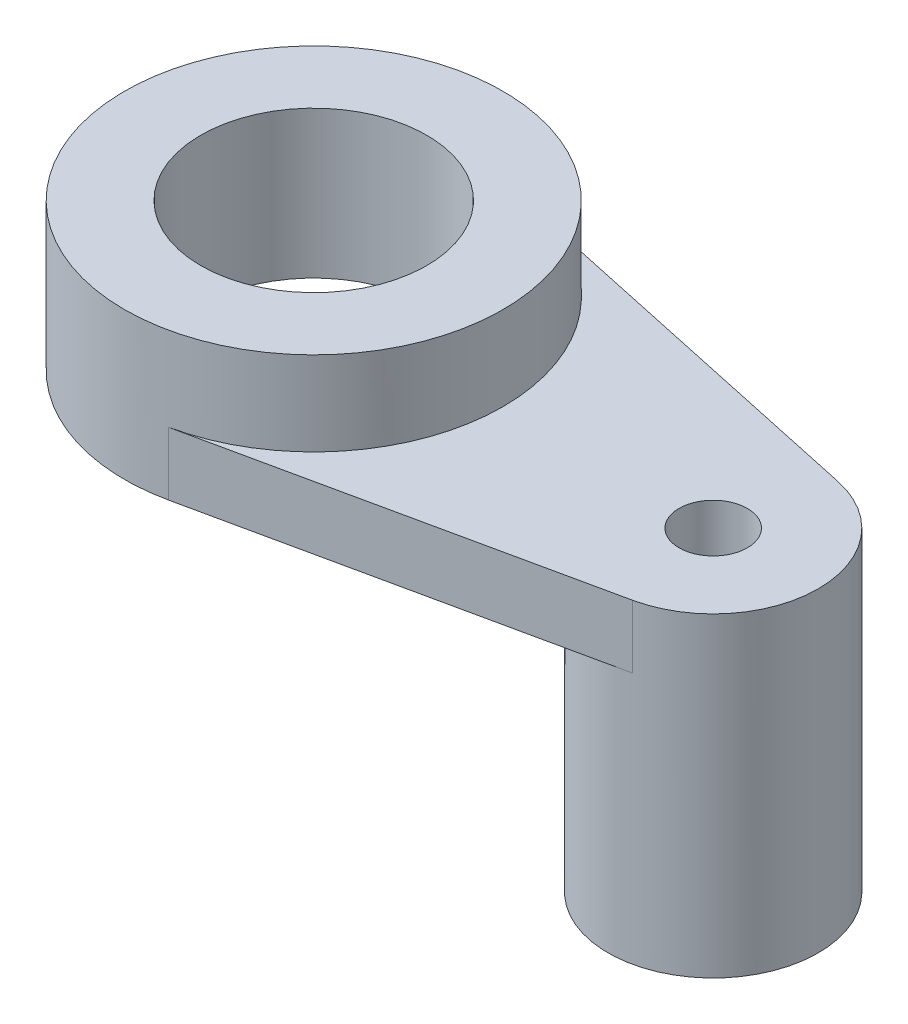
ISO-10303-21;
HEADER;
FILE_DESCRIPTION(('STEP AP214'),'2;1');
FILE_NAME('part.step','',(''),(''),'','','');
FILE_SCHEMA(('AUTOMOTIVE_DESIGN { 1 0 10303 214 1 1 1 1 }'));
ENDSEC;
DATA;
#1=APPLICATION_CONTEXT('core data for automotive mechanical design processes');
#2=APPLICATION_PROTOCOL_DEFINITION('international standard','automotive_design',2000,#1);
#3=PRODUCT_CONTEXT('',#1,'mechanical');
#4=PRODUCT('Part','Part','',(#3));
#5=PRODUCT_RELATED_PRODUCT_CATEGORY('part','',(#4));
#6=PRODUCT_DEFINITION_FORMATION('','',#4);
#7=PRODUCT_DEFINITION_CONTEXT('part definition',#1,'design');
#8=PRODUCT_DEFINITION('design','',#6,#7);
#9=PRODUCT_DEFINITION_SHAPE('','',#8);
#10=(LENGTH_UNIT() NAMED_UNIT(*) SI_UNIT(.MILLI.,.METRE.));
#11=(NAMED_UNIT(*) PLANE_ANGLE_UNIT() SI_UNIT($,.RADIAN.));
#12=(NAMED_UNIT(*) SI_UNIT($,.STERADIAN.) SOLID_ANGLE_UNIT());
#13=UNCERTAINTY_MEASURE_WITH_UNIT(LENGTH_MEASURE(1.E-05),#10,'distance_accuracy_value','');
#14=(GEOMETRIC_REPRESENTATION_CONTEXT(3) GLOBAL_UNCERTAINTY_ASSIGNED_CONTEXT((#13)) GLOBAL_UNIT_ASSIGNED_CONTEXT((#10,
#11,#12)) REPRESENTATION_CONTEXT('',''));
#15=CARTESIAN_POINT('',(0.,0.,0.));
#16=DIRECTION('',(0.,0.,1.));
#17=DIRECTION('',(1.,0.,0.));
#18=AXIS2_PLACEMENT_3D('',#15,#16,#17);
#19=CARTESIAN_POINT('',(0.,14.,0.));
#20=DIRECTION('',(0.,-1.,0.));
#21=DIRECTION('',(0.,0.,-1.));
#22=AXIS2_PLACEMENT_3D('',#19,#20,#21);
#23=CYLINDRICAL_SURFACE('',#22,18.);
#24=CARTESIAN_POINT('',(0.,14.,0.));
#25=DIRECTION('',(0.,1.,0.));
#26=DIRECTION('',(0.,0.,1.));
#27=AXIS2_PLACEMENT_3D('',#24,#25,#26);
#28=CIRCLE('',#27,18.);
#29=CARTESIAN_POINT('',(0.,14.,18.));
#30=VERTEX_POINT('',#29);
#31=EDGE_CURVE('E48',#30,#30,#28,.T.);
#32=ORIENTED_EDGE('',*,*,#31,.F.);
#33=EDGE_LOOP('',(#32));
#34=FACE_BOUND('',#33,.T.);
#35=DIRECTION('',(0.,-1.,0.));
#36=VECTOR('',#35,1.);
#37=CARTESIAN_POINT('',(3.78947368421052,6.,17.5965874304274));
#38=LINE('',#37,#36);
#39=CARTESIAN_POINT('',(3.78947368421052,6.,17.5965874304274));
#40=VERTEX_POINT('',#39);
#41=CARTESIAN_POINT('',(3.78947368421052,0.,17.5965874304274));
#42=VERTEX_POINT('',#41);
#43=EDGE_CURVE('E61',#40,#42,#38,.T.);
#44=ORIENTED_EDGE('',*,*,#43,.F.);
#45=CARTESIAN_POINT('',(0.,6.,0.));
#46=DIRECTION('',(0.,1.,0.));
#47=DIRECTION('',(0.,0.,1.));
#48=AXIS2_PLACEMENT_3D('',#45,#46,#47);
#49=CIRCLE('',#48,18.);
#50=CARTESIAN_POINT('',(3.78947368421052,6.,-17.5965874304274));
#51=VERTEX_POINT('',#50);
#52=EDGE_CURVE('E56',#40,#51,#49,.T.);
#53=ORIENTED_EDGE('',*,*,#52,.T.);
#54=DIRECTION('',(0.,-1.,0.));
#55=VECTOR('',#54,1.);
#56=CARTESIAN_POINT('',(3.78947368421052,6.,-17.5965874304274));
#57=LINE('',#56,#55);
#58=CARTESIAN_POINT('',(3.78947368421052,0.,-17.5965874304274));
#59=VERTEX_POINT('',#58);
#60=EDGE_CURVE('E100',#51,#59,#57,.T.);
#61=ORIENTED_EDGE('',*,*,#60,.T.);
#62=CARTESIAN_POINT('',(0.,0.,0.));
#63=DIRECTION('',(0.,1.,0.));
#64=DIRECTION('',(0.,0.,1.));
#65=AXIS2_PLACEMENT_3D('',#62,#63,#64);
#66=CIRCLE('',#65,18.);
#67=EDGE_CURVE('E43',#59,#42,#66,.T.);
#68=ORIENTED_EDGE('',*,*,#67,.T.);
#69=EDGE_LOOP('',(#44,#53,#61,#68));
#70=FACE_BOUND('',#69,.T.);
#71=ADVANCED_FACE('F39',(#34,#70),#23,.T.);
#72=CARTESIAN_POINT('',(0.,14.,0.));
#73=DIRECTION('',(0.,-1.,0.));
#74=DIRECTION('',(0.,0.,-1.));
#75=AXIS2_PLACEMENT_3D('',#72,#73,#74);
#76=CYLINDRICAL_SURFACE('',#75,10.75);
#77=CARTESIAN_POINT('',(0.,14.,0.));
#78=DIRECTION('',(0.,1.,0.));
#79=DIRECTION('',(0.,0.,1.));
#80=AXIS2_PLACEMENT_3D('',#77,#78,#79);
#81=CIRCLE('',#80,10.75);
#82=CARTESIAN_POINT('',(0.,14.,10.75));
#83=VERTEX_POINT('',#82);
#84=EDGE_CURVE('E121',#83,#83,#81,.T.);
#85=ORIENTED_EDGE('',*,*,#84,.T.);
#86=EDGE_LOOP('',(#85));
#87=FACE_BOUND('',#86,.T.);
#88=CARTESIAN_POINT('',(0.,0.,0.));
#89=DIRECTION('',(0.,1.,0.));
#90=DIRECTION('',(0.,0.,1.));
#91=AXIS2_PLACEMENT_3D('',#88,#89,#90);
#92=CIRCLE('',#91,10.75);
#93=CARTESIAN_POINT('',(0.,0.,10.75));
#94=VERTEX_POINT('',#93);
#95=EDGE_CURVE('E108',#94,#94,#92,.T.);
#96=ORIENTED_EDGE('',*,*,#95,.F.);
#97=EDGE_LOOP('',(#96));
#98=FACE_BOUND('',#97,.T.);
#99=ADVANCED_FACE('F41',(#87,#98),#76,.F.);
#100=CARTESIAN_POINT('',(0.,14.,0.));
#101=DIRECTION('',(0.,1.,0.));
#102=DIRECTION('',(0.,0.,1.));
#103=AXIS2_PLACEMENT_3D('',#100,#101,#102);
#104=PLANE('',#103);
#105=ORIENTED_EDGE('',*,*,#84,.F.);
#106=EDGE_LOOP('',(#105));
#107=FACE_BOUND('',#106,.T.);
#108=ORIENTED_EDGE('',*,*,#31,.T.);
#109=EDGE_LOOP('',(#108));
#110=FACE_BOUND('',#109,.T.);
#111=ADVANCED_FACE('F132',(#107,#110),#104,.T.);
#112=CARTESIAN_POINT('',(0.,0.,0.));
#113=DIRECTION('',(0.,1.,0.));
#114=DIRECTION('',(0.,0.,1.));
#115=AXIS2_PLACEMENT_3D('',#112,#113,#114);
#116=PLANE('',#115);
#117=CARTESIAN_POINT('',(38.,0.,0.));
#118=DIRECTION('',(0.,-1.,0.));
#119=DIRECTION('',(0.,0.,-1.));
#120=AXIS2_PLACEMENT_3D('',#117,#118,#119);
#121=CIRCLE('',#120,10.);
#122=CARTESIAN_POINT('',(40.1052631578947,0.,9.77588190579301));
#123=VERTEX_POINT('',#122);
#124=CARTESIAN_POINT('',(40.1052631578947,0.,-9.77588190579301));
#125=VERTEX_POINT('',#124);
#126=EDGE_CURVE('E11',#123,#125,#121,.T.);
#127=ORIENTED_EDGE('',*,*,#126,.F.);
#128=DIRECTION('',(-0.977588190579301,0.,0.210526315789473));
#129=VECTOR('',#128,1.);
#130=CARTESIAN_POINT('',(3.78947368421052,0.,17.5965874304274));
#131=LINE('',#130,#129);
#132=EDGE_CURVE('E90',#123,#42,#131,.T.);
#133=ORIENTED_EDGE('',*,*,#132,.T.);
#134=ORIENTED_EDGE('',*,*,#67,.F.);
#135=DIRECTION('',(-0.977588190579301,0.,-0.210526315789473));
#136=VECTOR('',#135,1.);
#137=CARTESIAN_POINT('',(3.78947368421052,0.,-17.5965874304274));
#138=LINE('',#137,#136);
#139=EDGE_CURVE('E81',#125,#59,#138,.T.);
#140=ORIENTED_EDGE('',*,*,#139,.F.);
#141=EDGE_LOOP('',(#127,#133,#134,#140));
#142=FACE_BOUND('',#141,.T.);
#143=ORIENTED_EDGE('',*,*,#95,.T.);
#144=EDGE_LOOP('',(#143));
#145=FACE_BOUND('',#144,.T.);
#146=ADVANCED_FACE('F83',(#142,#145),#116,.F.);
#147=CARTESIAN_POINT('',(3.78947368421052,6.,17.5965874304274));
#148=DIRECTION('',(0.210526315789473,0.,0.977588190579301));
#149=DIRECTION('',(0.977588190579301,0.,-0.210526315789473));
#150=AXIS2_PLACEMENT_3D('',#147,#148,#149);
#151=PLANE('',#150);
#152=ORIENTED_EDGE('',*,*,#132,.F.);
#153=DIRECTION('',(0.,-1.,0.));
#154=VECTOR('',#153,1.);
#155=CARTESIAN_POINT('',(40.1052631578947,6.,9.77588190579301));
#156=LINE('',#155,#154);
#157=CARTESIAN_POINT('',(40.1052631578947,6.,9.77588190579301));
#158=VERTEX_POINT('',#157);
#159=EDGE_CURVE('E99',#158,#123,#156,.T.);
#160=ORIENTED_EDGE('',*,*,#159,.F.);
#161=DIRECTION('',(-0.977588190579301,0.,0.210526315789473));
#162=VECTOR('',#161,1.);
#163=CARTESIAN_POINT('',(3.78947368421052,6.,17.5965874304274));
#164=LINE('',#163,#162);
#165=EDGE_CURVE('E89',#158,#40,#164,.T.);
#166=ORIENTED_EDGE('',*,*,#165,.T.);
#167=ORIENTED_EDGE('',*,*,#43,.T.);
#168=EDGE_LOOP('',(#152,#160,#166,#167));
#169=FACE_BOUND('',#168,.T.);
#170=ADVANCED_FACE('F110',(#169),#151,.T.);
#171=CARTESIAN_POINT('',(38.,6.,0.));
#172=DIRECTION('',(0.,-1.,0.));
#173=DIRECTION('',(0.,0.,-1.));
#174=AXIS2_PLACEMENT_3D('',#171,#172,#173);
#175=CYLINDRICAL_SURFACE('',#174,10.);
#176=ORIENTED_EDGE('',*,*,#159,.T.);
#177=ORIENTED_EDGE('',*,*,#126,.T.);
#178=DIRECTION('',(0.,-1.,0.));
#179=VECTOR('',#178,1.);
#180=CARTESIAN_POINT('',(40.1052631578947,6.,-9.77588190579301));
#181=LINE('',#180,#179);
#182=CARTESIAN_POINT('',(40.1052631578947,6.,-9.77588190579301));
#183=VERTEX_POINT('',#182);
#184=EDGE_CURVE('E94',#183,#125,#181,.T.);
#185=ORIENTED_EDGE('',*,*,#184,.F.);
#186=CARTESIAN_POINT('',(38.,6.,0.));
#187=DIRECTION('',(0.,1.,0.));
#188=DIRECTION('',(0.,0.,1.));
#189=AXIS2_PLACEMENT_3D('',#186,#187,#188);
#190=CIRCLE('',#189,10.);
#191=EDGE_CURVE('E105',#158,#183,#190,.T.);
#192=ORIENTED_EDGE('',*,*,#191,.F.);
#193=EDGE_LOOP('',(#176,#177,#185,#192));
#194=FACE_BOUND('',#193,.T.);
#195=CARTESIAN_POINT('',(38.,-24.,0.));
#196=DIRECTION('',(0.,-1.,0.));
#197=DIRECTION('',(0.,0.,-1.));
#198=AXIS2_PLACEMENT_3D('',#195,#196,#197);
#199=CIRCLE('',#198,10.);
#200=CARTESIAN_POINT('',(38.,-24.,-10.));
#201=VERTEX_POINT('',#200);
#202=EDGE_CURVE('E111',#201,#201,#199,.T.);
#203=ORIENTED_EDGE('',*,*,#202,.F.);
#204=EDGE_LOOP('',(#203));
#205=FACE_BOUND('',#204,.T.);
#206=ADVANCED_FACE('F102',(#194,#205),#175,.T.);
#207=CARTESIAN_POINT('',(3.78947368421052,6.,-17.5965874304274));
#208=DIRECTION('',(-0.210526315789473,0.,0.977588190579301));
#209=DIRECTION('',(0.977588190579301,0.,0.210526315789473));
#210=AXIS2_PLACEMENT_3D('',#207,#208,#209);
#211=PLANE('',#210);
#212=ORIENTED_EDGE('',*,*,#139,.T.);
#213=ORIENTED_EDGE('',*,*,#60,.F.);
#214=DIRECTION('',(-0.977588190579301,0.,-0.210526315789473));
#215=VECTOR('',#214,1.);
#216=CARTESIAN_POINT('',(3.78947368421052,6.,-17.5965874304274));
#217=LINE('',#216,#215);
#218=EDGE_CURVE('E96',#183,#51,#217,.T.);
#219=ORIENTED_EDGE('',*,*,#218,.F.);
#220=ORIENTED_EDGE('',*,*,#184,.T.);
#221=EDGE_LOOP('',(#212,#213,#219,#220));
#222=FACE_BOUND('',#221,.T.);
#223=ADVANCED_FACE('F95',(#222),#211,.F.);
#224=CARTESIAN_POINT('',(0.,6.,0.));
#225=DIRECTION('',(0.,1.,0.));
#226=DIRECTION('',(0.,0.,1.));
#227=AXIS2_PLACEMENT_3D('',#224,#225,#226);
#228=PLANE('',#227);
#229=CARTESIAN_POINT('',(38.,6.,0.));
#230=DIRECTION('',(0.,1.,0.));
#231=DIRECTION('',(0.,0.,1.));
#232=AXIS2_PLACEMENT_3D('',#229,#230,#231);
#233=CIRCLE('',#232,3.25);
#234=CARTESIAN_POINT('',(38.,6.,3.25));
#235=VERTEX_POINT('',#234);
#236=EDGE_CURVE('E114',#235,#235,#233,.T.);
#237=ORIENTED_EDGE('',*,*,#236,.F.);
#238=EDGE_LOOP('',(#237));
#239=FACE_BOUND('',#238,.T.);
#240=ORIENTED_EDGE('',*,*,#165,.F.);
#241=ORIENTED_EDGE('',*,*,#191,.T.);
#242=ORIENTED_EDGE('',*,*,#218,.T.);
#243=ORIENTED_EDGE('',*,*,#52,.F.);
#244=EDGE_LOOP('',(#240,#241,#242,#243));
#245=FACE_BOUND('',#244,.T.);
#246=ADVANCED_FACE('F147',(#239,#245),#228,.T.);
#247=CARTESIAN_POINT('',(38.,-24.,0.));
#248=DIRECTION('',(0.,-1.,0.));
#249=DIRECTION('',(0.,0.,-1.));
#250=AXIS2_PLACEMENT_3D('',#247,#248,#249);
#251=PLANE('',#250);
#252=CARTESIAN_POINT('',(38.,-24.,0.));
#253=DIRECTION('',(0.,-1.,0.));
#254=DIRECTION('',(0.,0.,-1.));
#255=AXIS2_PLACEMENT_3D('',#252,#253,#254);
#256=CIRCLE('',#255,3.25);
#257=CARTESIAN_POINT('',(38.,-24.,-3.25));
#258=VERTEX_POINT('',#257);
#259=EDGE_CURVE('E165',#258,#258,#256,.T.);
#260=ORIENTED_EDGE('',*,*,#259,.F.);
#261=EDGE_LOOP('',(#260));
#262=FACE_BOUND('',#261,.T.);
#263=ORIENTED_EDGE('',*,*,#202,.T.);
#264=EDGE_LOOP('',(#263));
#265=FACE_BOUND('',#264,.T.);
#266=ADVANCED_FACE('F150',(#262,#265),#251,.T.);
#267=CARTESIAN_POINT('',(38.,14.,0.));
#268=DIRECTION('',(0.,-1.,0.));
#269=DIRECTION('',(0.,0.,-1.));
#270=AXIS2_PLACEMENT_3D('',#267,#268,#269);
#271=CYLINDRICAL_SURFACE('',#270,3.25);
#272=ORIENTED_EDGE('',*,*,#236,.T.);
#273=EDGE_LOOP('',(#272));
#274=FACE_BOUND('',#273,.T.);
#275=ORIENTED_EDGE('',*,*,#259,.T.);
#276=EDGE_LOOP('',(#275));
#277=FACE_BOUND('',#276,.T.);
#278=ADVANCED_FACE('F154',(#274,#277),#271,.F.);
#279=CLOSED_SHELL('',(#71,#99,#111,#146,#170,#206,#223,#246,#266,#278));
#280=MANIFOLD_SOLID_BREP('B2',#279);
#281=ADVANCED_BREP_SHAPE_REPRESENTATION('',(#18,#280),#14);
#282=SHAPE_DEFINITION_REPRESENTATION(#9,#281);
ENDSEC;
END-ISO-10303-21;
